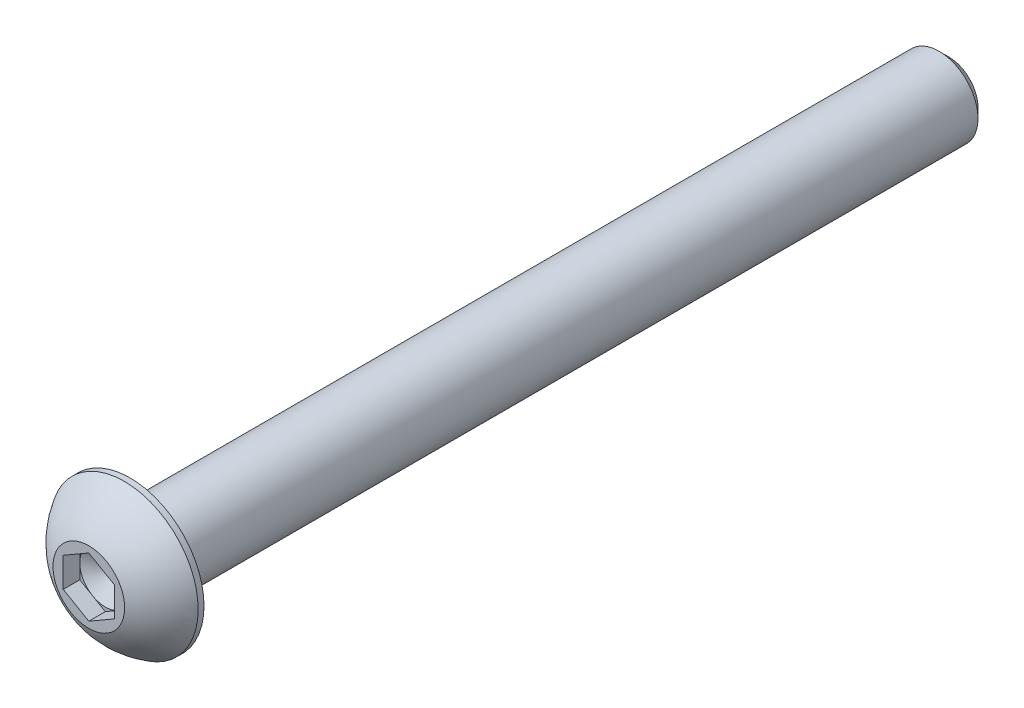
ISO-10303-21;
HEADER;
FILE_DESCRIPTION(('STEP AP214'),'2;1');
FILE_NAME('part.step','',(''),(''),'','','');
FILE_SCHEMA(('AUTOMOTIVE_DESIGN { 1 0 10303 214 1 1 1 1 }'));
ENDSEC;
DATA;
#1=APPLICATION_CONTEXT('core data for automotive mechanical design processes');
#2=APPLICATION_PROTOCOL_DEFINITION('international standard','automotive_design',2000,#1);
#3=PRODUCT_CONTEXT('',#1,'mechanical');
#4=PRODUCT('Part','Part','',(#3));
#5=PRODUCT_RELATED_PRODUCT_CATEGORY('part','',(#4));
#6=PRODUCT_DEFINITION_FORMATION('','',#4);
#7=PRODUCT_DEFINITION_CONTEXT('part definition',#1,'design');
#8=PRODUCT_DEFINITION('design','',#6,#7);
#9=PRODUCT_DEFINITION_SHAPE('','',#8);
#10=(LENGTH_UNIT() NAMED_UNIT(*) SI_UNIT(.MILLI.,.METRE.));
#11=(NAMED_UNIT(*) PLANE_ANGLE_UNIT() SI_UNIT($,.RADIAN.));
#12=(NAMED_UNIT(*) SI_UNIT($,.STERADIAN.) SOLID_ANGLE_UNIT());
#13=UNCERTAINTY_MEASURE_WITH_UNIT(LENGTH_MEASURE(1.E-05),#10,'distance_accuracy_value','');
#14=(GEOMETRIC_REPRESENTATION_CONTEXT(3) GLOBAL_UNCERTAINTY_ASSIGNED_CONTEXT((#13)) GLOBAL_UNIT_ASSIGNED_CONTEXT((#10,
#11,#12)) REPRESENTATION_CONTEXT('',''));
#15=CARTESIAN_POINT('',(0.,0.,0.));
#16=DIRECTION('',(0.,0.,1.));
#17=DIRECTION('',(1.,0.,0.));
#18=AXIS2_PLACEMENT_3D('',#15,#16,#17);
#19=CARTESIAN_POINT('',(0.,1.5875,26.6827));
#20=DIRECTION('',(0.,0.,-1.));
#21=DIRECTION('',(-1.,0.,0.));
#22=AXIS2_PLACEMENT_3D('',#19,#20,#21);
#23=PLANE('',#22);
#24=CARTESIAN_POINT('',(0.,0.,26.6827));
#25=DIRECTION('',(0.,0.,1.));
#26=DIRECTION('',(1.,0.,0.));
#27=AXIS2_PLACEMENT_3D('',#24,#25,#26);
#28=CIRCLE('',#27,2.2225);
#29=CARTESIAN_POINT('',(0.,2.2225,26.6827));
#30=VERTEX_POINT('',#29);
#31=EDGE_CURVE('E141',#30,#30,#28,.T.);
#32=ORIENTED_EDGE('',*,*,#31,.T.);
#33=EDGE_LOOP('',(#32));
#34=FACE_BOUND('',#33,.T.);
#35=DIRECTION('',(-0.866025403784439,0.499999999999999,0.));
#36=VECTOR('',#35,1.);
#37=CARTESIAN_POINT('',(1.5875,0.916543552338531,26.6827));
#38=LINE('',#37,#36);
#39=CARTESIAN_POINT('',(1.5875,0.916543552338531,26.6827));
#40=VERTEX_POINT('',#39);
#41=CARTESIAN_POINT('',(0.,1.83308710467706,26.6827));
#42=VERTEX_POINT('',#41);
#43=EDGE_CURVE('E105',#40,#42,#38,.T.);
#44=ORIENTED_EDGE('',*,*,#43,.F.);
#45=DIRECTION('',(0.,1.,0.));
#46=VECTOR('',#45,1.);
#47=CARTESIAN_POINT('',(1.5875,-0.91654355233853,26.6827));
#48=LINE('',#47,#46);
#49=CARTESIAN_POINT('',(1.5875,-0.91654355233853,26.6827));
#50=VERTEX_POINT('',#49);
#51=EDGE_CURVE('E351',#50,#40,#48,.T.);
#52=ORIENTED_EDGE('',*,*,#51,.F.);
#53=DIRECTION('',(0.866025403784438,0.5,0.));
#54=VECTOR('',#53,1.);
#55=CARTESIAN_POINT('',(0.,-1.83308710467706,26.6827));
#56=LINE('',#55,#54);
#57=CARTESIAN_POINT('',(0.,-1.83308710467706,26.6827));
#58=VERTEX_POINT('',#57);
#59=EDGE_CURVE('E376',#58,#50,#56,.T.);
#60=ORIENTED_EDGE('',*,*,#59,.F.);
#61=DIRECTION('',(0.866025403784439,-0.499999999999999,0.));
#62=VECTOR('',#61,1.);
#63=CARTESIAN_POINT('',(-1.5875,-0.916543552338532,26.6827));
#64=LINE('',#63,#62);
#65=CARTESIAN_POINT('',(-1.5875,-0.916543552338532,26.6827));
#66=VERTEX_POINT('',#65);
#67=EDGE_CURVE('E378',#66,#58,#64,.T.);
#68=ORIENTED_EDGE('',*,*,#67,.F.);
#69=DIRECTION('',(0.,-1.,0.));
#70=VECTOR('',#69,1.);
#71=CARTESIAN_POINT('',(-1.5875,0.91654355233853,26.6827));
#72=LINE('',#71,#70);
#73=CARTESIAN_POINT('',(-1.5875,0.91654355233853,26.6827));
#74=VERTEX_POINT('',#73);
#75=EDGE_CURVE('E108',#74,#66,#72,.T.);
#76=ORIENTED_EDGE('',*,*,#75,.F.);
#77=DIRECTION('',(-0.866025403784438,-0.5,0.));
#78=VECTOR('',#77,1.);
#79=CARTESIAN_POINT('',(0.,1.83308710467706,26.6827));
#80=LINE('',#79,#78);
#81=EDGE_CURVE('E102',#42,#74,#80,.T.);
#82=ORIENTED_EDGE('',*,*,#81,.F.);
#83=EDGE_LOOP('',(#44,#52,#60,#68,#76,#82));
#84=FACE_BOUND('',#83,.T.);
#85=ADVANCED_FACE('F32',(#34,#84),#23,.F.);
#86=CARTESIAN_POINT('',(0.,0.,-26.6827));
#87=DIRECTION('',(0.,0.,1.));
#88=DIRECTION('',(1.,0.,0.));
#89=AXIS2_PLACEMENT_3D('',#86,#87,#88);
#90=CONICAL_SURFACE('',#89,1.8176875,0.785398163397447);
#91=CARTESIAN_POINT('',(0.,0.,-26.0873875));
#92=DIRECTION('',(0.,0.,1.));
#93=DIRECTION('',(1.,0.,0.));
#94=AXIS2_PLACEMENT_3D('',#91,#92,#93);
#95=CIRCLE('',#94,2.413);
#96=CARTESIAN_POINT('',(2.413,0.,-26.0873875));
#97=VERTEX_POINT('',#96);
#98=EDGE_CURVE('E11',#97,#97,#95,.T.);
#99=ORIENTED_EDGE('',*,*,#98,.F.);
#100=EDGE_LOOP('',(#99));
#101=FACE_BOUND('',#100,.T.);
#102=CARTESIAN_POINT('',(0.,0.,-26.6827));
#103=DIRECTION('',(0.,0.,1.));
#104=DIRECTION('',(1.,0.,0.));
#105=AXIS2_PLACEMENT_3D('',#102,#103,#104);
#106=CIRCLE('',#105,1.8176875);
#107=CARTESIAN_POINT('',(1.8176875,0.,-26.6827));
#108=VERTEX_POINT('',#107);
#109=EDGE_CURVE('E128',#108,#108,#106,.T.);
#110=ORIENTED_EDGE('',*,*,#109,.T.);
#111=EDGE_LOOP('',(#110));
#112=FACE_BOUND('',#111,.T.);
#113=ADVANCED_FACE('F34',(#101,#112),#90,.T.);
#114=CARTESIAN_POINT('',(0.,0.,26.6827));
#115=DIRECTION('',(0.,0.,1.));
#116=DIRECTION('',(1.,0.,0.));
#117=AXIS2_PLACEMENT_3D('',#114,#115,#116);
#118=CYLINDRICAL_SURFACE('',#117,2.413);
#119=CARTESIAN_POINT('',(0.,0.,24.1173));
#120=DIRECTION('',(0.,0.,1.));
#121=DIRECTION('',(1.,0.,0.));
#122=AXIS2_PLACEMENT_3D('',#119,#120,#121);
#123=CIRCLE('',#122,2.413);
#124=CARTESIAN_POINT('',(2.413,0.,24.1173));
#125=VERTEX_POINT('',#124);
#126=EDGE_CURVE('E40',#125,#125,#123,.T.);
#127=ORIENTED_EDGE('',*,*,#126,.F.);
#128=EDGE_LOOP('',(#127));
#129=FACE_BOUND('',#128,.T.);
#130=ORIENTED_EDGE('',*,*,#98,.T.);
#131=EDGE_LOOP('',(#130));
#132=FACE_BOUND('',#131,.T.);
#133=ADVANCED_FACE('F155',(#129,#132),#118,.T.);
#134=CARTESIAN_POINT('',(0.,4.5847,24.1173));
#135=DIRECTION('',(0.,0.,1.));
#136=DIRECTION('',(1.,0.,0.));
#137=AXIS2_PLACEMENT_3D('',#134,#135,#136);
#138=PLANE('',#137);
#139=CARTESIAN_POINT('',(0.,0.,24.1173));
#140=DIRECTION('',(0.,0.,1.));
#141=DIRECTION('',(1.,0.,0.));
#142=AXIS2_PLACEMENT_3D('',#139,#140,#141);
#143=CIRCLE('',#142,4.5847);
#144=CARTESIAN_POINT('',(4.5847,0.,24.1173));
#145=VERTEX_POINT('',#144);
#146=EDGE_CURVE('E148',#145,#145,#143,.T.);
#147=ORIENTED_EDGE('',*,*,#146,.F.);
#148=EDGE_LOOP('',(#147));
#149=FACE_BOUND('',#148,.T.);
#150=ORIENTED_EDGE('',*,*,#126,.T.);
#151=EDGE_LOOP('',(#150));
#152=FACE_BOUND('',#151,.T.);
#153=ADVANCED_FACE('F153',(#149,#152),#138,.F.);
#154=CARTESIAN_POINT('',(0.,0.,26.6827));
#155=DIRECTION('',(0.,0.,1.));
#156=DIRECTION('',(1.,0.,0.));
#157=AXIS2_PLACEMENT_3D('',#154,#155,#156);
#158=CYLINDRICAL_SURFACE('',#157,4.5847);
#159=CARTESIAN_POINT('',(0.,0.,24.4801571428571));
#160=DIRECTION('',(0.,0.,1.));
#161=DIRECTION('',(1.,0.,0.));
#162=AXIS2_PLACEMENT_3D('',#159,#160,#161);
#163=CIRCLE('',#162,4.5847);
#164=CARTESIAN_POINT('',(0.,4.5847,24.4801571428571));
#165=VERTEX_POINT('',#164);
#166=EDGE_CURVE('E145',#165,#165,#163,.T.);
#167=ORIENTED_EDGE('',*,*,#166,.F.);
#168=EDGE_LOOP('',(#167));
#169=FACE_BOUND('',#168,.T.);
#170=ORIENTED_EDGE('',*,*,#146,.T.);
#171=EDGE_LOOP('',(#170));
#172=FACE_BOUND('',#171,.T.);
#173=ADVANCED_FACE('F173',(#169,#172),#158,.T.);
#174=CARTESIAN_POINT('',(0.,0.,21.9311096257943));
#175=DIRECTION('',(0.,0.,1.));
#176=DIRECTION('',(0.,1.,0.));
#177=AXIS2_PLACEMENT_3D('',#174,#175,#176);
#178=SPHERICAL_SURFACE('',#177,5.24567606074225);
#179=CARTESIAN_POINT('',(0.,2.2225,26.6827));
#180=CARTESIAN_POINT('',(0.,2.2534773813734,26.6682107482465));
#181=CARTESIAN_POINT('',(0.,2.28431303158805,26.6534184862584));
#182=CARTESIAN_POINT('',(0.,2.34568916388882,26.6232337810172));
#183=CARTESIAN_POINT('',(0.,2.37622964597494,26.6078413377641));
#184=CARTESIAN_POINT('',(0.,2.43700373620764,26.5764621091974));
#185=CARTESIAN_POINT('',(0.,2.46723734435421,26.5604753238838));
#186=CARTESIAN_POINT('',(0.,2.52738612853076,26.5279135392546));
#187=CARTESIAN_POINT('',(0.,2.55730130456074,26.511338539939));
#188=CARTESIAN_POINT('',(0.,2.61680178002346,26.4776066638777));
#189=CARTESIAN_POINT('',(0.,2.64638707945621,26.4604497871321));
#190=CARTESIAN_POINT('',(0.,2.70521648559602,26.4255607197714));
#191=CARTESIAN_POINT('',(0.,2.73446059230308,26.4078285291564));
#192=CARTESIAN_POINT('',(0.,2.7925964267897,26.371795616496));
#193=CARTESIAN_POINT('',(0.,2.82148815456926,26.3534948944507));
#194=CARTESIAN_POINT('',(0.,2.87890817994248,26.3163319191528));
#195=CARTESIAN_POINT('',(0.,2.90743647753613,26.2974696659004));
#196=CARTESIAN_POINT('',(0.,2.96411873025196,26.2591908431166));
#197=CARTESIAN_POINT('',(0.,2.99227268537413,26.2397742735852));
#198=CARTESIAN_POINT('',(0.,3.04819548406127,26.2003942452242));
#199=CARTESIAN_POINT('',(0.,3.07596432762625,26.1804307863946));
#200=CARTESIAN_POINT('',(0.,3.13110628141819,26.139964615601));
#201=CARTESIAN_POINT('',(0.,3.15847939164516,26.1194619036369));
#202=CARTESIAN_POINT('',(0.,3.21281940835191,26.0779250690077));
#203=CARTESIAN_POINT('',(0.,3.23978631483169,26.0568909463426));
#204=CARTESIAN_POINT('',(0.,3.29330360901048,26.0142993360128));
#205=CARTESIAN_POINT('',(0.,3.31985399670949,25.9927418483482));
#206=CARTESIAN_POINT('',(0.,3.37252809761462,25.9491117539117));
#207=CARTESIAN_POINT('',(0.,3.39865181082073,25.9270391471398));
#208=CARTESIAN_POINT('',(0.,3.45046257023396,25.8823872574181));
#209=CARTESIAN_POINT('',(0.,3.47614961644107,25.8598079744681));
#210=CARTESIAN_POINT('',(0.,3.52707721637841,25.8141513691265));
#211=CARTESIAN_POINT('',(0.,3.55231777010864,25.7910740467348));
#212=CARTESIAN_POINT('',(0.,3.60234273040088,25.7444301897495));
#213=CARTESIAN_POINT('',(0.,3.6271271369629,25.720863655156));
#214=CARTESIAN_POINT('',(0.,3.67623032270694,25.6732503881342));
#215=CARTESIAN_POINT('',(0.,3.70054910188896,25.649203655706));
#216=CARTESIAN_POINT('',(0.,3.74871173076698,25.6006391910609));
#217=CARTESIAN_POINT('',(0.,3.77255558046299,25.5761214588442));
#218=CARTESIAN_POINT('',(0.,3.8197592299269,25.526624372829));
#219=CARTESIAN_POINT('',(0.,3.8431190296948,25.5016450190307));
#220=CARTESIAN_POINT('',(0.,3.88934564401292,25.4512342446329));
#221=CARTESIAN_POINT('',(0.,3.91221245856314,25.4258028240335));
#222=CARTESIAN_POINT('',(0.,3.95744435572676,25.3744976437328));
#223=CARTESIAN_POINT('',(0.,3.97980943834017,25.3486238840316));
#224=CARTESIAN_POINT('',(0.,4.02402931682667,25.2964439224243));
#225=CARTESIAN_POINT('',(0.,4.04588411269977,25.2701377205183));
#226=CARTESIAN_POINT('',(0.,4.08907505809202,25.2171029368114));
#227=CARTESIAN_POINT('',(0.,4.11041120761118,25.1903743550105));
#228=CARTESIAN_POINT('',(0.,4.15255669906198,25.136505035384));
#229=CARTESIAN_POINT('',(0.,4.17336604099362,25.1093642975583));
#230=CARTESIAN_POINT('',(0.,4.21444995756537,25.0546810474174));
#231=CARTESIAN_POINT('',(0.,4.23472453220549,25.0271385351022));
#232=CARTESIAN_POINT('',(0.,4.27473115896065,24.9716622711516));
#233=CARTESIAN_POINT('',(0.,4.2944632110757,24.9437285195162));
#234=CARTESIAN_POINT('',(0.,4.33337724537133,24.887480461924));
#235=CARTESIAN_POINT('',(0.,4.3525592275519,24.8591661559672));
#236=CARTESIAN_POINT('',(0.,4.39036578383499,24.8021678196325));
#237=CARTESIAN_POINT('',(0.,4.40899035793751,24.7734837892547));
#238=CARTESIAN_POINT('',(0.,4.44567497738742,24.7157569778758));
#239=CARTESIAN_POINT('',(0.,4.46373502273481,24.6867141968748));
#240=CARTESIAN_POINT('',(0.,4.49928366405766,24.6282809860341));
#241=CARTESIAN_POINT('',(0.,4.5167722600331,24.5988905561945));
#242=CARTESIAN_POINT('',(0.,4.55117135982879,24.5397733169156));
#243=CARTESIAN_POINT('',(0.,4.56808186364902,24.5100465074765));
#244=CARTESIAN_POINT('',(0.,4.5847,24.4801571428571));
#245=B_SPLINE_CURVE_WITH_KNOTS('',3,(#179,#180,#181,#182,#183,#184,#185,#186,#187,#188,#189,
#190,#191,#192,#193,#194,#195,#196,#197,#198,#199,#200,#201,#202,#203,#204,#205,#206,#207,#208,
#209,#210,#211,#212,#213,#214,#215,#216,#217,#218,#219,#220,#221,#222,#223,#224,#225,#226,#227,
#228,#229,#230,#231,#232,#233,#234,#235,#236,#237,#238,#239,#240,#241,#242,#243,#244),
.UNSPECIFIED.,.F.,.F.,(4,2,2,2,2,2,2,2,2,2,2,2,2,2,2,2,2,2,2,2,2,2,2,2,2,2,2,2,2,2,2,2,4),(0.,
0.102593825831513,0.205187651663028,0.307781477494541,0.410375303326054,0.512969129157568,
0.61556295498908,0.718156780820595,0.82075060665211,0.923344432483623,1.02593825831514,
1.12853208414665,1.23112590997816,1.33371973580968,1.43631356164119,1.5389073874727,
1.64150121330422,1.74409503913573,1.84668886496725,1.94928269079876,2.05187651663027,
2.15447034246179,2.2570641682933,2.35965799412481,2.46225181995633,2.56484564578784,
2.66743947161936,2.77003329745087,2.87262712328238,2.97522094911389,3.07781477494541,
3.18040860077692,3.28300242660844),.UNSPECIFIED.);
#246=EDGE_CURVE('BSEAM166',#30,#165,#245,.T.);
#247=ORIENTED_EDGE('',*,*,#31,.F.);
#248=ORIENTED_EDGE('',*,*,#166,.T.);
#249=ORIENTED_EDGE('',*,*,#246,.T.);
#250=ORIENTED_EDGE('',*,*,#246,.F.);
#251=EDGE_LOOP('',(#247,#249,#248,#250));
#252=FACE_BOUND('',#251,.T.);
#253=ADVANCED_FACE('F166',(#252),#178,.T.);
#254=CARTESIAN_POINT('',(0.,1.8176875,-26.6827));
#255=DIRECTION('',(0.,0.,1.));
#256=DIRECTION('',(1.,0.,0.));
#257=AXIS2_PLACEMENT_3D('',#254,#255,#256);
#258=PLANE('',#257);
#259=ORIENTED_EDGE('',*,*,#109,.F.);
#260=EDGE_LOOP('',(#259));
#261=FACE_BOUND('',#260,.T.);
#262=ADVANCED_FACE('F164',(#261),#258,.F.);
#263=CARTESIAN_POINT('',(1.5875,0.916543552338531,26.6827));
#264=DIRECTION('',(-0.499999999999999,-0.866025403784439,0.));
#265=DIRECTION('',(0.866025403784439,-0.5,0.));
#266=AXIS2_PLACEMENT_3D('',#263,#264,#265);
#267=PLANE('',#266);
#268=DIRECTION('',(0.,0.,-1.));
#269=VECTOR('',#268,1.);
#270=CARTESIAN_POINT('',(1.5875,0.916543552338531,26.6827));
#271=LINE('',#270,#269);
#272=CARTESIAN_POINT('',(1.5875,0.916543552338531,25.65654));
#273=VERTEX_POINT('',#272);
#274=EDGE_CURVE('E120',#40,#273,#271,.T.);
#275=ORIENTED_EDGE('',*,*,#274,.F.);
#276=ORIENTED_EDGE('',*,*,#43,.T.);
#277=DIRECTION('',(0.,0.,-1.));
#278=VECTOR('',#277,1.);
#279=CARTESIAN_POINT('',(0.,1.83308710467706,26.6827));
#280=LINE('',#279,#278);
#281=CARTESIAN_POINT('',(0.,1.83308710467706,25.65654));
#282=VERTEX_POINT('',#281);
#283=EDGE_CURVE('E118',#42,#282,#280,.T.);
#284=ORIENTED_EDGE('',*,*,#283,.T.);
#285=DIRECTION('',(-0.866025403784439,0.499999999999999,0.));
#286=VECTOR('',#285,1.);
#287=CARTESIAN_POINT('',(1.5875,0.916543552338531,25.65654));
#288=LINE('',#287,#286);
#289=CARTESIAN_POINT('',(0.793749999999999,1.3748153285078,25.65654));
#290=VERTEX_POINT('',#289);
#291=EDGE_CURVE('E374',#290,#282,#288,.T.);
#292=ORIENTED_EDGE('',*,*,#291,.F.);
#293=EDGE_CURVE('E47',#273,#290,#288,.T.);
#294=ORIENTED_EDGE('',*,*,#293,.F.);
#295=EDGE_LOOP('',(#275,#276,#284,#292,#294));
#296=FACE_BOUND('',#295,.T.);
#297=ADVANCED_FACE('F117',(#296),#267,.T.);
#298=CARTESIAN_POINT('',(0.,1.83308710467706,26.6827));
#299=DIRECTION('',(0.5,-0.866025403784438,0.));
#300=DIRECTION('',(0.866025403784438,0.500000000000001,0.));
#301=AXIS2_PLACEMENT_3D('',#298,#299,#300);
#302=PLANE('',#301);
#303=ORIENTED_EDGE('',*,*,#283,.F.);
#304=ORIENTED_EDGE('',*,*,#81,.T.);
#305=DIRECTION('',(0.,0.,-1.));
#306=VECTOR('',#305,1.);
#307=CARTESIAN_POINT('',(-1.5875,0.91654355233853,26.6827));
#308=LINE('',#307,#306);
#309=CARTESIAN_POINT('',(-1.5875,0.91654355233853,25.65654));
#310=VERTEX_POINT('',#309);
#311=EDGE_CURVE('E129',#74,#310,#308,.T.);
#312=ORIENTED_EDGE('',*,*,#311,.T.);
#313=DIRECTION('',(-0.866025403784438,-0.5,0.));
#314=VECTOR('',#313,1.);
#315=CARTESIAN_POINT('',(0.,1.83308710467706,25.65654));
#316=LINE('',#315,#314);
#317=CARTESIAN_POINT('',(-0.793750000000001,1.3748153285078,25.65654));
#318=VERTEX_POINT('',#317);
#319=EDGE_CURVE('E372',#318,#310,#316,.T.);
#320=ORIENTED_EDGE('',*,*,#319,.F.);
#321=EDGE_CURVE('E127',#282,#318,#316,.T.);
#322=ORIENTED_EDGE('',*,*,#321,.F.);
#323=EDGE_LOOP('',(#303,#304,#312,#320,#322));
#324=FACE_BOUND('',#323,.T.);
#325=ADVANCED_FACE('F124',(#324),#302,.T.);
#326=CARTESIAN_POINT('',(-1.5875,0.91654355233853,26.6827));
#327=DIRECTION('',(1.,0.,0.));
#328=DIRECTION('',(0.,1.,0.));
#329=AXIS2_PLACEMENT_3D('',#326,#327,#328);
#330=PLANE('',#329);
#331=ORIENTED_EDGE('',*,*,#311,.F.);
#332=ORIENTED_EDGE('',*,*,#75,.T.);
#333=DIRECTION('',(0.,0.,-1.));
#334=VECTOR('',#333,1.);
#335=CARTESIAN_POINT('',(-1.5875,-0.916543552338532,26.6827));
#336=LINE('',#335,#334);
#337=CARTESIAN_POINT('',(-1.5875,-0.916543552338532,25.65654));
#338=VERTEX_POINT('',#337);
#339=EDGE_CURVE('E134',#66,#338,#336,.T.);
#340=ORIENTED_EDGE('',*,*,#339,.T.);
#341=DIRECTION('',(0.,-1.,0.));
#342=VECTOR('',#341,1.);
#343=CARTESIAN_POINT('',(-1.5875,0.91654355233853,25.65654));
#344=LINE('',#343,#342);
#345=CARTESIAN_POINT('',(-1.5875,0.,25.65654));
#346=VERTEX_POINT('',#345);
#347=EDGE_CURVE('E360',#346,#338,#344,.T.);
#348=ORIENTED_EDGE('',*,*,#347,.F.);
#349=EDGE_CURVE('E368',#310,#346,#344,.T.);
#350=ORIENTED_EDGE('',*,*,#349,.F.);
#351=EDGE_LOOP('',(#331,#332,#340,#348,#350));
#352=FACE_BOUND('',#351,.T.);
#353=ADVANCED_FACE('F227',(#352),#330,.T.);
#354=CARTESIAN_POINT('',(-1.5875,-0.916543552338532,26.6827));
#355=DIRECTION('',(0.499999999999999,0.866025403784439,0.));
#356=DIRECTION('',(-0.866025403784439,0.5,0.));
#357=AXIS2_PLACEMENT_3D('',#354,#355,#356);
#358=PLANE('',#357);
#359=ORIENTED_EDGE('',*,*,#339,.F.);
#360=ORIENTED_EDGE('',*,*,#67,.T.);
#361=DIRECTION('',(0.,0.,-1.));
#362=VECTOR('',#361,1.);
#363=CARTESIAN_POINT('',(0.,-1.83308710467706,26.6827));
#364=LINE('',#363,#362);
#365=CARTESIAN_POINT('',(0.,-1.83308710467706,25.65654));
#366=VERTEX_POINT('',#365);
#367=EDGE_CURVE('E353',#58,#366,#364,.T.);
#368=ORIENTED_EDGE('',*,*,#367,.T.);
#369=DIRECTION('',(0.866025403784439,-0.499999999999999,0.));
#370=VECTOR('',#369,1.);
#371=CARTESIAN_POINT('',(-1.5875,-0.916543552338532,25.65654));
#372=LINE('',#371,#370);
#373=CARTESIAN_POINT('',(-0.793749999999999,-1.3748153285078,25.65654));
#374=VERTEX_POINT('',#373);
#375=EDGE_CURVE('E366',#374,#366,#372,.T.);
#376=ORIENTED_EDGE('',*,*,#375,.F.);
#377=EDGE_CURVE('E365',#338,#374,#372,.T.);
#378=ORIENTED_EDGE('',*,*,#377,.F.);
#379=EDGE_LOOP('',(#359,#360,#368,#376,#378));
#380=FACE_BOUND('',#379,.T.);
#381=ADVANCED_FACE('F236',(#380),#358,.T.);
#382=CARTESIAN_POINT('',(0.,-1.83308710467706,26.6827));
#383=DIRECTION('',(-0.5,0.866025403784438,0.));
#384=DIRECTION('',(-0.866025403784438,-0.500000000000001,0.));
#385=AXIS2_PLACEMENT_3D('',#382,#383,#384);
#386=PLANE('',#385);
#387=ORIENTED_EDGE('',*,*,#367,.F.);
#388=ORIENTED_EDGE('',*,*,#59,.T.);
#389=DIRECTION('',(0.,0.,-1.));
#390=VECTOR('',#389,1.);
#391=CARTESIAN_POINT('',(1.5875,-0.91654355233853,26.6827));
#392=LINE('',#391,#390);
#393=CARTESIAN_POINT('',(1.5875,-0.91654355233853,25.65654));
#394=VERTEX_POINT('',#393);
#395=EDGE_CURVE('E350',#50,#394,#392,.T.);
#396=ORIENTED_EDGE('',*,*,#395,.T.);
#397=DIRECTION('',(0.866025403784438,0.5,0.));
#398=VECTOR('',#397,1.);
#399=CARTESIAN_POINT('',(0.,-1.83308710467706,25.65654));
#400=LINE('',#399,#398);
#401=CARTESIAN_POINT('',(0.793750000000001,-1.3748153285078,25.65654));
#402=VERTEX_POINT('',#401);
#403=EDGE_CURVE('E344',#402,#394,#400,.T.);
#404=ORIENTED_EDGE('',*,*,#403,.F.);
#405=EDGE_CURVE('E341',#366,#402,#400,.T.);
#406=ORIENTED_EDGE('',*,*,#405,.F.);
#407=EDGE_LOOP('',(#387,#388,#396,#404,#406));
#408=FACE_BOUND('',#407,.T.);
#409=ADVANCED_FACE('F246',(#408),#386,.T.);
#410=CARTESIAN_POINT('',(1.5875,-0.91654355233853,26.6827));
#411=DIRECTION('',(-1.,0.,0.));
#412=DIRECTION('',(0.,-1.,0.));
#413=AXIS2_PLACEMENT_3D('',#410,#411,#412);
#414=PLANE('',#413);
#415=ORIENTED_EDGE('',*,*,#51,.T.);
#416=ORIENTED_EDGE('',*,*,#274,.T.);
#417=DIRECTION('',(0.,1.,0.));
#418=VECTOR('',#417,1.);
#419=CARTESIAN_POINT('',(1.5875,-0.91654355233853,25.65654));
#420=LINE('',#419,#418);
#421=CARTESIAN_POINT('',(1.5875,0.,25.65654));
#422=VERTEX_POINT('',#421);
#423=EDGE_CURVE('E337',#422,#273,#420,.T.);
#424=ORIENTED_EDGE('',*,*,#423,.F.);
#425=EDGE_CURVE('E121',#394,#422,#420,.T.);
#426=ORIENTED_EDGE('',*,*,#425,.F.);
#427=ORIENTED_EDGE('',*,*,#395,.F.);
#428=EDGE_LOOP('',(#415,#416,#424,#426,#427));
#429=FACE_BOUND('',#428,.T.);
#430=ADVANCED_FACE('F256',(#429),#414,.T.);
#431=CARTESIAN_POINT('',(0.,0.,25.65654));
#432=DIRECTION('',(0.,0.,1.));
#433=DIRECTION('',(1.,0.,0.));
#434=AXIS2_PLACEMENT_3D('',#431,#432,#433);
#435=PLANE('',#434);
#436=CARTESIAN_POINT('',(0.,0.,25.65654));
#437=DIRECTION('',(0.,0.,1.));
#438=DIRECTION('',(1.,0.,0.));
#439=AXIS2_PLACEMENT_3D('',#436,#437,#438);
#440=CIRCLE('',#439,1.5875);
#441=EDGE_CURVE('E132',#402,#422,#440,.T.);
#442=ORIENTED_EDGE('',*,*,#441,.F.);
#443=ORIENTED_EDGE('',*,*,#403,.T.);
#444=ORIENTED_EDGE('',*,*,#425,.T.);
#445=EDGE_LOOP('',(#442,#443,#444));
#446=FACE_BOUND('',#445,.T.);
#447=ADVANCED_FACE('F266',(#446),#435,.T.);
#448=EDGE_CURVE('E383',#374,#402,#440,.T.);
#449=ORIENTED_EDGE('',*,*,#448,.F.);
#450=ORIENTED_EDGE('',*,*,#375,.T.);
#451=ORIENTED_EDGE('',*,*,#405,.T.);
#452=EDGE_LOOP('',(#449,#450,#451));
#453=FACE_BOUND('',#452,.T.);
#454=ADVANCED_FACE('F276',(#453),#435,.T.);
#455=EDGE_CURVE('E384',#346,#374,#440,.T.);
#456=ORIENTED_EDGE('',*,*,#455,.F.);
#457=ORIENTED_EDGE('',*,*,#347,.T.);
#458=ORIENTED_EDGE('',*,*,#377,.T.);
#459=EDGE_LOOP('',(#456,#457,#458));
#460=FACE_BOUND('',#459,.T.);
#461=ADVANCED_FACE('F287',(#460),#435,.T.);
#462=EDGE_CURVE('E385',#318,#346,#440,.T.);
#463=ORIENTED_EDGE('',*,*,#462,.F.);
#464=ORIENTED_EDGE('',*,*,#319,.T.);
#465=ORIENTED_EDGE('',*,*,#349,.T.);
#466=EDGE_LOOP('',(#463,#464,#465));
#467=FACE_BOUND('',#466,.T.);
#468=ADVANCED_FACE('F296',(#467),#435,.T.);
#469=EDGE_CURVE('E142',#290,#318,#440,.T.);
#470=ORIENTED_EDGE('',*,*,#469,.F.);
#471=ORIENTED_EDGE('',*,*,#291,.T.);
#472=ORIENTED_EDGE('',*,*,#321,.T.);
#473=EDGE_LOOP('',(#470,#471,#472));
#474=FACE_BOUND('',#473,.T.);
#475=ADVANCED_FACE('F305',(#474),#435,.T.);
#476=EDGE_CURVE('E138',#422,#290,#440,.T.);
#477=ORIENTED_EDGE('',*,*,#476,.F.);
#478=ORIENTED_EDGE('',*,*,#423,.T.);
#479=ORIENTED_EDGE('',*,*,#293,.T.);
#480=EDGE_LOOP('',(#477,#478,#479));
#481=FACE_BOUND('',#480,.T.);
#482=ADVANCED_FACE('F279',(#481),#435,.T.);
#483=CARTESIAN_POINT('',(0.,0.,25.65654));
#484=DIRECTION('',(0.,0.,1.));
#485=DIRECTION('',(1.,0.,0.));
#486=AXIS2_PLACEMENT_3D('',#483,#484,#485);
#487=CONICAL_SURFACE('',#486,1.5875,1.0471975511966);
#488=CARTESIAN_POINT('',(0.,0.,24.7399964476615));
#489=VERTEX_POINT('',#488);
#490=VERTEX_LOOP('',#489);
#491=FACE_BOUND('',#490,.T.);
#492=ORIENTED_EDGE('',*,*,#476,.T.);
#493=ORIENTED_EDGE('',*,*,#469,.T.);
#494=ORIENTED_EDGE('',*,*,#462,.T.);
#495=ORIENTED_EDGE('',*,*,#455,.T.);
#496=ORIENTED_EDGE('',*,*,#448,.T.);
#497=ORIENTED_EDGE('',*,*,#441,.T.);
#498=EDGE_LOOP('',(#492,#493,#494,#495,#496,#497));
#499=FACE_BOUND('',#498,.T.);
#500=ADVANCED_FACE('F182',(#491,#499),#487,.F.);
#501=CLOSED_SHELL('',(#85,#113,#133,#153,#173,#253,#262,#297,#325,#353,#381,#409,#430,#447,#454,
#461,#468,#475,#482,#500));
#502=MANIFOLD_SOLID_BREP('B2',#501);
#503=ADVANCED_BREP_SHAPE_REPRESENTATION('',(#18,#502),#14);
#504=SHAPE_DEFINITION_REPRESENTATION(#9,#503);
ENDSEC;
END-ISO-10303-21;
